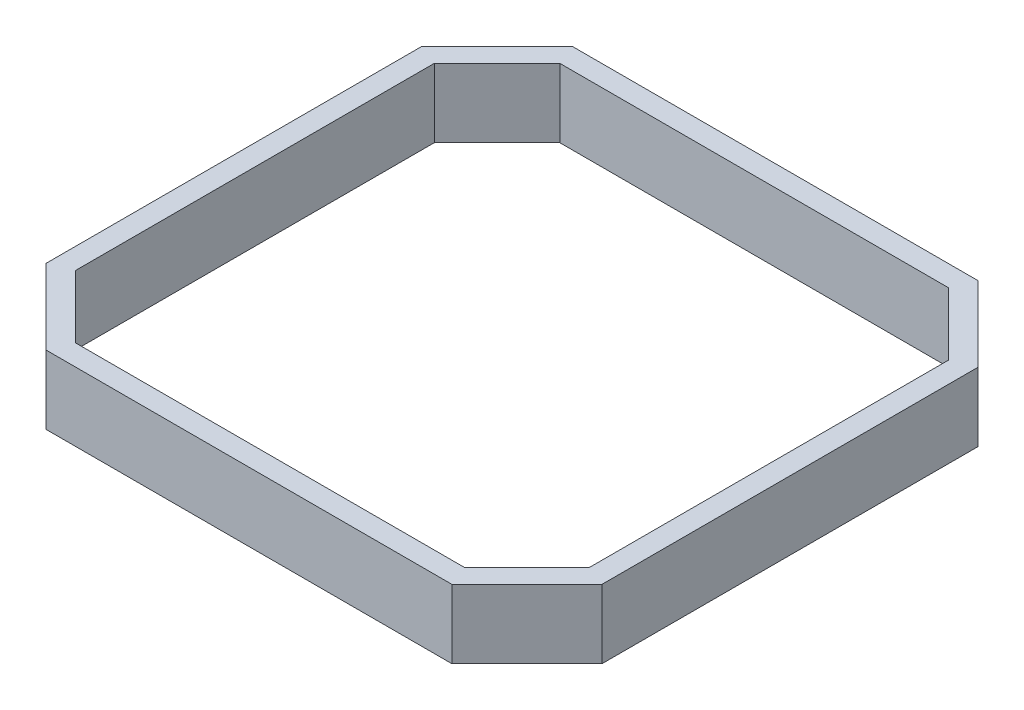
ISO-10303-21;
HEADER;
FILE_DESCRIPTION(('STEP AP214'),'2;1');
FILE_NAME('part.step','',(''),(''),'','','');
FILE_SCHEMA(('AUTOMOTIVE_DESIGN { 1 0 10303 214 1 1 1 1 }'));
ENDSEC;
DATA;
#1=APPLICATION_CONTEXT('core data for automotive mechanical design processes');
#2=APPLICATION_PROTOCOL_DEFINITION('international standard','automotive_design',2000,#1);
#3=PRODUCT_CONTEXT('',#1,'mechanical');
#4=PRODUCT('Part','Part','',(#3));
#5=PRODUCT_RELATED_PRODUCT_CATEGORY('part','',(#4));
#6=PRODUCT_DEFINITION_FORMATION('','',#4);
#7=PRODUCT_DEFINITION_CONTEXT('part definition',#1,'design');
#8=PRODUCT_DEFINITION('design','',#6,#7);
#9=PRODUCT_DEFINITION_SHAPE('','',#8);
#10=(LENGTH_UNIT() NAMED_UNIT(*) SI_UNIT(.MILLI.,.METRE.));
#11=(NAMED_UNIT(*) PLANE_ANGLE_UNIT() SI_UNIT($,.RADIAN.));
#12=(NAMED_UNIT(*) SI_UNIT($,.STERADIAN.) SOLID_ANGLE_UNIT());
#13=UNCERTAINTY_MEASURE_WITH_UNIT(LENGTH_MEASURE(1.E-05),#10,'distance_accuracy_value','');
#14=(GEOMETRIC_REPRESENTATION_CONTEXT(3) GLOBAL_UNCERTAINTY_ASSIGNED_CONTEXT((#13)) GLOBAL_UNIT_ASSIGNED_CONTEXT((#10,
#11,#12)) REPRESENTATION_CONTEXT('',''));
#15=CARTESIAN_POINT('',(0.,0.,0.));
#16=DIRECTION('',(0.,0.,1.));
#17=DIRECTION('',(1.,0.,0.));
#18=AXIS2_PLACEMENT_3D('',#15,#16,#17);
#19=CARTESIAN_POINT('',(0.,11.5,0.));
#20=DIRECTION('',(0.,-1.,0.));
#21=DIRECTION('',(0.,0.,-1.));
#22=AXIS2_PLACEMENT_3D('',#19,#20,#21);
#23=PLANE('',#22);
#24=DIRECTION('',(0.,0.,1.));
#25=VECTOR('',#24,1.);
#26=CARTESIAN_POINT('',(-46.5,11.5,31.4497474683058));
#27=LINE('',#26,#25);
#28=CARTESIAN_POINT('',(-46.5,11.5,-31.4497474683058));
#29=VERTEX_POINT('',#28);
#30=CARTESIAN_POINT('',(-46.5,11.5,31.4497474683058));
#31=VERTEX_POINT('',#30);
#32=EDGE_CURVE('E210',#29,#31,#27,.T.);
#33=ORIENTED_EDGE('',*,*,#32,.T.);
#34=DIRECTION('',(0.707106781186547,0.,0.707106781186548));
#35=VECTOR('',#34,1.);
#36=CARTESIAN_POINT('',(-46.5,11.5,31.4497474683058));
#37=LINE('',#36,#35);
#38=CARTESIAN_POINT('',(-33.9497474683058,11.5,44.));
#39=VERTEX_POINT('',#38);
#40=EDGE_CURVE('E213',#31,#39,#37,.T.);
#41=ORIENTED_EDGE('',*,*,#40,.T.);
#42=DIRECTION('',(1.,0.,0.));
#43=VECTOR('',#42,1.);
#44=CARTESIAN_POINT('',(-33.9497474683058,11.5,44.));
#45=LINE('',#44,#43);
#46=CARTESIAN_POINT('',(33.9497474683058,11.5,44.));
#47=VERTEX_POINT('',#46);
#48=EDGE_CURVE('E216',#39,#47,#45,.T.);
#49=ORIENTED_EDGE('',*,*,#48,.T.);
#50=DIRECTION('',(0.707106781186547,0.,-0.707106781186547));
#51=VECTOR('',#50,1.);
#52=CARTESIAN_POINT('',(33.9497474683058,11.5,44.));
#53=LINE('',#52,#51);
#54=CARTESIAN_POINT('',(46.5,11.5,31.4497474683058));
#55=VERTEX_POINT('',#54);
#56=EDGE_CURVE('E218',#47,#55,#53,.T.);
#57=ORIENTED_EDGE('',*,*,#56,.T.);
#58=DIRECTION('',(0.,0.,-1.));
#59=VECTOR('',#58,1.);
#60=CARTESIAN_POINT('',(46.5,11.5,31.4497474683058));
#61=LINE('',#60,#59);
#62=CARTESIAN_POINT('',(46.5,11.5,-31.4497474683058));
#63=VERTEX_POINT('',#62);
#64=EDGE_CURVE('E220',#55,#63,#61,.T.);
#65=ORIENTED_EDGE('',*,*,#64,.T.);
#66=DIRECTION('',(-0.707106781186547,0.,-0.707106781186548));
#67=VECTOR('',#66,1.);
#68=CARTESIAN_POINT('',(33.9497474683058,11.5,-44.));
#69=LINE('',#68,#67);
#70=CARTESIAN_POINT('',(33.9497474683058,11.5,-44.));
#71=VERTEX_POINT('',#70);
#72=EDGE_CURVE('E222',#63,#71,#69,.T.);
#73=ORIENTED_EDGE('',*,*,#72,.T.);
#74=DIRECTION('',(-1.,0.,0.));
#75=VECTOR('',#74,1.);
#76=CARTESIAN_POINT('',(-33.9497474683058,11.5,-44.));
#77=LINE('',#76,#75);
#78=CARTESIAN_POINT('',(-33.9497474683058,11.5,-44.));
#79=VERTEX_POINT('',#78);
#80=EDGE_CURVE('E224',#71,#79,#77,.T.);
#81=ORIENTED_EDGE('',*,*,#80,.T.);
#82=DIRECTION('',(-0.707106781186547,0.,0.707106781186548));
#83=VECTOR('',#82,1.);
#84=CARTESIAN_POINT('',(-46.5,11.5,-31.4497474683058));
#85=LINE('',#84,#83);
#86=EDGE_CURVE('E226',#79,#29,#85,.T.);
#87=ORIENTED_EDGE('',*,*,#86,.T.);
#88=EDGE_LOOP('',(#33,#41,#49,#57,#65,#73,#81,#87));
#89=FACE_BOUND('',#88,.T.);
#90=DIRECTION('',(0.,0.,1.));
#91=VECTOR('',#90,1.);
#92=CARTESIAN_POINT('',(-43.,11.5,30.));
#93=LINE('',#92,#91);
#94=CARTESIAN_POINT('',(-43.,11.5,-30.));
#95=VERTEX_POINT('',#94);
#96=CARTESIAN_POINT('',(-43.,11.5,30.));
#97=VERTEX_POINT('',#96);
#98=EDGE_CURVE('E145',#95,#97,#93,.T.);
#99=ORIENTED_EDGE('',*,*,#98,.F.);
#100=DIRECTION('',(-0.707106781186547,0.,0.707106781186548));
#101=VECTOR('',#100,1.);
#102=CARTESIAN_POINT('',(-43.,11.5,-30.));
#103=LINE('',#102,#101);
#104=CARTESIAN_POINT('',(-32.5,11.5,-40.5));
#105=VERTEX_POINT('',#104);
#106=EDGE_CURVE('E178',#105,#95,#103,.T.);
#107=ORIENTED_EDGE('',*,*,#106,.F.);
#108=DIRECTION('',(-1.,0.,0.));
#109=VECTOR('',#108,1.);
#110=CARTESIAN_POINT('',(-32.5,11.5,-40.5));
#111=LINE('',#110,#109);
#112=CARTESIAN_POINT('',(32.5,11.5,-40.5));
#113=VERTEX_POINT('',#112);
#114=EDGE_CURVE('E176',#113,#105,#111,.T.);
#115=ORIENTED_EDGE('',*,*,#114,.F.);
#116=DIRECTION('',(-0.707106781186547,0.,-0.707106781186548));
#117=VECTOR('',#116,1.);
#118=CARTESIAN_POINT('',(32.5,11.5,-40.5));
#119=LINE('',#118,#117);
#120=CARTESIAN_POINT('',(43.,11.5,-30.));
#121=VERTEX_POINT('',#120);
#122=EDGE_CURVE('E174',#121,#113,#119,.T.);
#123=ORIENTED_EDGE('',*,*,#122,.F.);
#124=DIRECTION('',(0.,0.,-1.));
#125=VECTOR('',#124,1.);
#126=CARTESIAN_POINT('',(43.,11.5,30.));
#127=LINE('',#126,#125);
#128=CARTESIAN_POINT('',(43.,11.5,30.));
#129=VERTEX_POINT('',#128);
#130=EDGE_CURVE('E172',#129,#121,#127,.T.);
#131=ORIENTED_EDGE('',*,*,#130,.F.);
#132=DIRECTION('',(0.707106781186547,0.,-0.707106781186548));
#133=VECTOR('',#132,1.);
#134=CARTESIAN_POINT('',(32.5,11.5,40.5));
#135=LINE('',#134,#133);
#136=CARTESIAN_POINT('',(32.5,11.5,40.5));
#137=VERTEX_POINT('',#136);
#138=EDGE_CURVE('E168',#137,#129,#135,.T.);
#139=ORIENTED_EDGE('',*,*,#138,.F.);
#140=DIRECTION('',(1.,0.,0.));
#141=VECTOR('',#140,1.);
#142=CARTESIAN_POINT('',(-32.5,11.5,40.5));
#143=LINE('',#142,#141);
#144=CARTESIAN_POINT('',(-32.5,11.5,40.5));
#145=VERTEX_POINT('',#144);
#146=EDGE_CURVE('E166',#145,#137,#143,.T.);
#147=ORIENTED_EDGE('',*,*,#146,.F.);
#148=DIRECTION('',(0.707106781186547,0.,0.707106781186548));
#149=VECTOR('',#148,1.);
#150=CARTESIAN_POINT('',(-43.,11.5,30.));
#151=LINE('',#150,#149);
#152=EDGE_CURVE('E153',#97,#145,#151,.T.);
#153=ORIENTED_EDGE('',*,*,#152,.F.);
#154=EDGE_LOOP('',(#99,#107,#115,#123,#131,#139,#147,#153));
#155=FACE_BOUND('',#154,.T.);
#156=ADVANCED_FACE('F32',(#89,#155),#23,.F.);
#157=CARTESIAN_POINT('',(0.,0.,0.));
#158=DIRECTION('',(0.,-1.,0.));
#159=DIRECTION('',(0.,0.,-1.));
#160=AXIS2_PLACEMENT_3D('',#157,#158,#159);
#161=PLANE('',#160);
#162=DIRECTION('',(0.,0.,1.));
#163=VECTOR('',#162,1.);
#164=CARTESIAN_POINT('',(-46.5,0.,31.4497474683058));
#165=LINE('',#164,#163);
#166=CARTESIAN_POINT('',(-46.5,0.,-31.4497474683058));
#167=VERTEX_POINT('',#166);
#168=CARTESIAN_POINT('',(-46.5,0.,31.4497474683058));
#169=VERTEX_POINT('',#168);
#170=EDGE_CURVE('E161',#167,#169,#165,.T.);
#171=ORIENTED_EDGE('',*,*,#170,.F.);
#172=DIRECTION('',(-0.707106781186547,0.,0.707106781186548));
#173=VECTOR('',#172,1.);
#174=CARTESIAN_POINT('',(-46.5,0.,-31.4497474683058));
#175=LINE('',#174,#173);
#176=CARTESIAN_POINT('',(-33.9497474683058,0.,-44.));
#177=VERTEX_POINT('',#176);
#178=EDGE_CURVE('E214',#177,#167,#175,.T.);
#179=ORIENTED_EDGE('',*,*,#178,.F.);
#180=DIRECTION('',(-1.,0.,0.));
#181=VECTOR('',#180,1.);
#182=CARTESIAN_POINT('',(-33.9497474683058,0.,-44.));
#183=LINE('',#182,#181);
#184=CARTESIAN_POINT('',(33.9497474683058,0.,-44.));
#185=VERTEX_POINT('',#184);
#186=EDGE_CURVE('E241',#185,#177,#183,.T.);
#187=ORIENTED_EDGE('',*,*,#186,.F.);
#188=DIRECTION('',(-0.707106781186547,0.,-0.707106781186548));
#189=VECTOR('',#188,1.);
#190=CARTESIAN_POINT('',(33.9497474683058,0.,-44.));
#191=LINE('',#190,#189);
#192=CARTESIAN_POINT('',(46.5,0.,-31.4497474683058));
#193=VERTEX_POINT('',#192);
#194=EDGE_CURVE('E239',#193,#185,#191,.T.);
#195=ORIENTED_EDGE('',*,*,#194,.F.);
#196=DIRECTION('',(0.,0.,-1.));
#197=VECTOR('',#196,1.);
#198=CARTESIAN_POINT('',(46.5,0.,31.4497474683058));
#199=LINE('',#198,#197);
#200=CARTESIAN_POINT('',(46.5,0.,31.4497474683058));
#201=VERTEX_POINT('',#200);
#202=EDGE_CURVE('E237',#201,#193,#199,.T.);
#203=ORIENTED_EDGE('',*,*,#202,.F.);
#204=DIRECTION('',(0.707106781186547,0.,-0.707106781186547));
#205=VECTOR('',#204,1.);
#206=CARTESIAN_POINT('',(33.9497474683058,0.,44.));
#207=LINE('',#206,#205);
#208=CARTESIAN_POINT('',(33.9497474683058,0.,44.));
#209=VERTEX_POINT('',#208);
#210=EDGE_CURVE('E235',#209,#201,#207,.T.);
#211=ORIENTED_EDGE('',*,*,#210,.F.);
#212=DIRECTION('',(1.,0.,0.));
#213=VECTOR('',#212,1.);
#214=CARTESIAN_POINT('',(-33.9497474683058,0.,44.));
#215=LINE('',#214,#213);
#216=CARTESIAN_POINT('',(-33.9497474683058,0.,44.));
#217=VERTEX_POINT('',#216);
#218=EDGE_CURVE('E233',#217,#209,#215,.T.);
#219=ORIENTED_EDGE('',*,*,#218,.F.);
#220=DIRECTION('',(0.707106781186547,0.,0.707106781186548));
#221=VECTOR('',#220,1.);
#222=CARTESIAN_POINT('',(-46.5,0.,31.4497474683058));
#223=LINE('',#222,#221);
#224=EDGE_CURVE('E231',#169,#217,#223,.T.);
#225=ORIENTED_EDGE('',*,*,#224,.F.);
#226=EDGE_LOOP('',(#171,#179,#187,#195,#203,#211,#219,#225));
#227=FACE_BOUND('',#226,.T.);
#228=DIRECTION('',(-0.707106781186547,0.,0.707106781186548));
#229=VECTOR('',#228,1.);
#230=CARTESIAN_POINT('',(-43.,0.,-30.));
#231=LINE('',#230,#229);
#232=CARTESIAN_POINT('',(-32.5,0.,-40.5));
#233=VERTEX_POINT('',#232);
#234=CARTESIAN_POINT('',(-43.,0.,-30.));
#235=VERTEX_POINT('',#234);
#236=EDGE_CURVE('E154',#233,#235,#231,.T.);
#237=ORIENTED_EDGE('',*,*,#236,.T.);
#238=DIRECTION('',(0.,0.,1.));
#239=VECTOR('',#238,1.);
#240=CARTESIAN_POINT('',(-43.,0.,30.));
#241=LINE('',#240,#239);
#242=CARTESIAN_POINT('',(-43.,0.,30.));
#243=VERTEX_POINT('',#242);
#244=EDGE_CURVE('E55',#235,#243,#241,.T.);
#245=ORIENTED_EDGE('',*,*,#244,.T.);
#246=DIRECTION('',(0.707106781186547,0.,0.707106781186548));
#247=VECTOR('',#246,1.);
#248=CARTESIAN_POINT('',(-43.,0.,30.));
#249=LINE('',#248,#247);
#250=CARTESIAN_POINT('',(-32.5,0.,40.5));
#251=VERTEX_POINT('',#250);
#252=EDGE_CURVE('E160',#243,#251,#249,.T.);
#253=ORIENTED_EDGE('',*,*,#252,.T.);
#254=DIRECTION('',(1.,0.,0.));
#255=VECTOR('',#254,1.);
#256=CARTESIAN_POINT('',(-32.5,0.,40.5));
#257=LINE('',#256,#255);
#258=CARTESIAN_POINT('',(32.5,0.,40.5));
#259=VERTEX_POINT('',#258);
#260=EDGE_CURVE('E182',#251,#259,#257,.T.);
#261=ORIENTED_EDGE('',*,*,#260,.T.);
#262=DIRECTION('',(0.707106781186547,0.,-0.707106781186548));
#263=VECTOR('',#262,1.);
#264=CARTESIAN_POINT('',(32.5,0.,40.5));
#265=LINE('',#264,#263);
#266=CARTESIAN_POINT('',(43.,0.,30.));
#267=VERTEX_POINT('',#266);
#268=EDGE_CURVE('E185',#259,#267,#265,.T.);
#269=ORIENTED_EDGE('',*,*,#268,.T.);
#270=DIRECTION('',(0.,0.,-1.));
#271=VECTOR('',#270,1.);
#272=CARTESIAN_POINT('',(43.,0.,30.));
#273=LINE('',#272,#271);
#274=CARTESIAN_POINT('',(43.,0.,-30.));
#275=VERTEX_POINT('',#274);
#276=EDGE_CURVE('E188',#267,#275,#273,.T.);
#277=ORIENTED_EDGE('',*,*,#276,.T.);
#278=DIRECTION('',(-0.707106781186547,0.,-0.707106781186548));
#279=VECTOR('',#278,1.);
#280=CARTESIAN_POINT('',(32.5,0.,-40.5));
#281=LINE('',#280,#279);
#282=CARTESIAN_POINT('',(32.5,0.,-40.5));
#283=VERTEX_POINT('',#282);
#284=EDGE_CURVE('E191',#275,#283,#281,.T.);
#285=ORIENTED_EDGE('',*,*,#284,.T.);
#286=DIRECTION('',(-1.,0.,0.));
#287=VECTOR('',#286,1.);
#288=CARTESIAN_POINT('',(-32.5,0.,-40.5));
#289=LINE('',#288,#287);
#290=EDGE_CURVE('E194',#283,#233,#289,.T.);
#291=ORIENTED_EDGE('',*,*,#290,.T.);
#292=EDGE_LOOP('',(#237,#245,#253,#261,#269,#277,#285,#291));
#293=FACE_BOUND('',#292,.T.);
#294=ADVANCED_FACE('F271',(#227,#293),#161,.T.);
#295=CARTESIAN_POINT('',(-46.5,11.5,31.4497474683058));
#296=DIRECTION('',(1.,0.,0.));
#297=DIRECTION('',(0.,0.,-1.));
#298=AXIS2_PLACEMENT_3D('',#295,#296,#297);
#299=PLANE('',#298);
#300=ORIENTED_EDGE('',*,*,#170,.T.);
#301=DIRECTION('',(0.,-1.,0.));
#302=VECTOR('',#301,1.);
#303=CARTESIAN_POINT('',(-46.5,11.5,31.4497474683058));
#304=LINE('',#303,#302);
#305=EDGE_CURVE('E11',#31,#169,#304,.T.);
#306=ORIENTED_EDGE('',*,*,#305,.F.);
#307=ORIENTED_EDGE('',*,*,#32,.F.);
#308=DIRECTION('',(0.,-1.,0.));
#309=VECTOR('',#308,1.);
#310=CARTESIAN_POINT('',(-46.5,11.5,-31.4497474683058));
#311=LINE('',#310,#309);
#312=EDGE_CURVE('E228',#29,#167,#311,.T.);
#313=ORIENTED_EDGE('',*,*,#312,.T.);
#314=EDGE_LOOP('',(#300,#306,#307,#313));
#315=FACE_BOUND('',#314,.T.);
#316=ADVANCED_FACE('F34',(#315),#299,.F.);
#317=CARTESIAN_POINT('',(-46.5,11.5,31.4497474683058));
#318=DIRECTION('',(0.707106781186548,0.,-0.707106781186547));
#319=DIRECTION('',(-0.707106781186547,0.,-0.707106781186548));
#320=AXIS2_PLACEMENT_3D('',#317,#318,#319);
#321=PLANE('',#320);
#322=ORIENTED_EDGE('',*,*,#224,.T.);
#323=DIRECTION('',(0.,-1.,0.));
#324=VECTOR('',#323,1.);
#325=CARTESIAN_POINT('',(-33.9497474683058,11.5,44.));
#326=LINE('',#325,#324);
#327=EDGE_CURVE('E40',#39,#217,#326,.T.);
#328=ORIENTED_EDGE('',*,*,#327,.F.);
#329=ORIENTED_EDGE('',*,*,#40,.F.);
#330=ORIENTED_EDGE('',*,*,#305,.T.);
#331=EDGE_LOOP('',(#322,#328,#329,#330));
#332=FACE_BOUND('',#331,.T.);
#333=ADVANCED_FACE('F288',(#332),#321,.F.);
#334=CARTESIAN_POINT('',(-33.9497474683058,11.5,44.));
#335=DIRECTION('',(0.,0.,-1.));
#336=DIRECTION('',(-1.,0.,0.));
#337=AXIS2_PLACEMENT_3D('',#334,#335,#336);
#338=PLANE('',#337);
#339=ORIENTED_EDGE('',*,*,#218,.T.);
#340=DIRECTION('',(0.,-1.,0.));
#341=VECTOR('',#340,1.);
#342=CARTESIAN_POINT('',(33.9497474683058,11.5,44.));
#343=LINE('',#342,#341);
#344=EDGE_CURVE('E258',#47,#209,#343,.T.);
#345=ORIENTED_EDGE('',*,*,#344,.F.);
#346=ORIENTED_EDGE('',*,*,#48,.F.);
#347=ORIENTED_EDGE('',*,*,#327,.T.);
#348=EDGE_LOOP('',(#339,#345,#346,#347));
#349=FACE_BOUND('',#348,.T.);
#350=ADVANCED_FACE('F265',(#349),#338,.F.);
#351=CARTESIAN_POINT('',(33.9497474683058,11.5,44.));
#352=DIRECTION('',(-0.707106781186548,0.,-0.707106781186548));
#353=DIRECTION('',(-0.707106781186548,0.,0.707106781186548));
#354=AXIS2_PLACEMENT_3D('',#351,#352,#353);
#355=PLANE('',#354);
#356=ORIENTED_EDGE('',*,*,#210,.T.);
#357=DIRECTION('',(0.,-1.,0.));
#358=VECTOR('',#357,1.);
#359=CARTESIAN_POINT('',(46.5,11.5,31.4497474683058));
#360=LINE('',#359,#358);
#361=EDGE_CURVE('E255',#55,#201,#360,.T.);
#362=ORIENTED_EDGE('',*,*,#361,.F.);
#363=ORIENTED_EDGE('',*,*,#56,.F.);
#364=ORIENTED_EDGE('',*,*,#344,.T.);
#365=EDGE_LOOP('',(#356,#362,#363,#364));
#366=FACE_BOUND('',#365,.T.);
#367=ADVANCED_FACE('F277',(#366),#355,.F.);
#368=CARTESIAN_POINT('',(46.5,11.5,31.4497474683058));
#369=DIRECTION('',(-1.,0.,0.));
#370=DIRECTION('',(0.,0.,1.));
#371=AXIS2_PLACEMENT_3D('',#368,#369,#370);
#372=PLANE('',#371);
#373=ORIENTED_EDGE('',*,*,#202,.T.);
#374=DIRECTION('',(0.,-1.,0.));
#375=VECTOR('',#374,1.);
#376=CARTESIAN_POINT('',(46.5,11.5,-31.4497474683058));
#377=LINE('',#376,#375);
#378=EDGE_CURVE('E252',#63,#193,#377,.T.);
#379=ORIENTED_EDGE('',*,*,#378,.F.);
#380=ORIENTED_EDGE('',*,*,#64,.F.);
#381=ORIENTED_EDGE('',*,*,#361,.T.);
#382=EDGE_LOOP('',(#373,#379,#380,#381));
#383=FACE_BOUND('',#382,.T.);
#384=ADVANCED_FACE('F281',(#383),#372,.F.);
#385=CARTESIAN_POINT('',(33.9497474683058,11.5,-44.));
#386=DIRECTION('',(-0.707106781186548,0.,0.707106781186547));
#387=DIRECTION('',(0.707106781186547,0.,0.707106781186548));
#388=AXIS2_PLACEMENT_3D('',#385,#386,#387);
#389=PLANE('',#388);
#390=ORIENTED_EDGE('',*,*,#194,.T.);
#391=DIRECTION('',(0.,-1.,0.));
#392=VECTOR('',#391,1.);
#393=CARTESIAN_POINT('',(33.9497474683058,11.5,-44.));
#394=LINE('',#393,#392);
#395=EDGE_CURVE('E249',#71,#185,#394,.T.);
#396=ORIENTED_EDGE('',*,*,#395,.F.);
#397=ORIENTED_EDGE('',*,*,#72,.F.);
#398=ORIENTED_EDGE('',*,*,#378,.T.);
#399=EDGE_LOOP('',(#390,#396,#397,#398));
#400=FACE_BOUND('',#399,.T.);
#401=ADVANCED_FACE('F301',(#400),#389,.F.);
#402=CARTESIAN_POINT('',(-33.9497474683058,11.5,-44.));
#403=DIRECTION('',(0.,0.,1.));
#404=DIRECTION('',(1.,0.,0.));
#405=AXIS2_PLACEMENT_3D('',#402,#403,#404);
#406=PLANE('',#405);
#407=ORIENTED_EDGE('',*,*,#186,.T.);
#408=DIRECTION('',(0.,-1.,0.));
#409=VECTOR('',#408,1.);
#410=CARTESIAN_POINT('',(-33.9497474683058,11.5,-44.));
#411=LINE('',#410,#409);
#412=EDGE_CURVE('E246',#79,#177,#411,.T.);
#413=ORIENTED_EDGE('',*,*,#412,.F.);
#414=ORIENTED_EDGE('',*,*,#80,.F.);
#415=ORIENTED_EDGE('',*,*,#395,.T.);
#416=EDGE_LOOP('',(#407,#413,#414,#415));
#417=FACE_BOUND('',#416,.T.);
#418=ADVANCED_FACE('F299',(#417),#406,.F.);
#419=CARTESIAN_POINT('',(-46.5,11.5,-31.4497474683058));
#420=DIRECTION('',(0.707106781186548,0.,0.707106781186547));
#421=DIRECTION('',(0.707106781186547,0.,-0.707106781186548));
#422=AXIS2_PLACEMENT_3D('',#419,#420,#421);
#423=PLANE('',#422);
#424=ORIENTED_EDGE('',*,*,#178,.T.);
#425=ORIENTED_EDGE('',*,*,#312,.F.);
#426=ORIENTED_EDGE('',*,*,#86,.F.);
#427=ORIENTED_EDGE('',*,*,#412,.T.);
#428=EDGE_LOOP('',(#424,#425,#426,#427));
#429=FACE_BOUND('',#428,.T.);
#430=ADVANCED_FACE('F294',(#429),#423,.F.);
#431=CARTESIAN_POINT('',(-43.,11.5,30.));
#432=DIRECTION('',(1.,0.,0.));
#433=DIRECTION('',(0.,0.,-1.));
#434=AXIS2_PLACEMENT_3D('',#431,#432,#433);
#435=PLANE('',#434);
#436=ORIENTED_EDGE('',*,*,#244,.F.);
#437=DIRECTION('',(0.,-1.,0.));
#438=VECTOR('',#437,1.);
#439=CARTESIAN_POINT('',(-43.,11.5,-30.));
#440=LINE('',#439,#438);
#441=EDGE_CURVE('E149',#95,#235,#440,.T.);
#442=ORIENTED_EDGE('',*,*,#441,.F.);
#443=ORIENTED_EDGE('',*,*,#98,.T.);
#444=DIRECTION('',(0.,-1.,0.));
#445=VECTOR('',#444,1.);
#446=CARTESIAN_POINT('',(-43.,11.5,30.));
#447=LINE('',#446,#445);
#448=EDGE_CURVE('E148',#97,#243,#447,.T.);
#449=ORIENTED_EDGE('',*,*,#448,.T.);
#450=EDGE_LOOP('',(#436,#442,#443,#449));
#451=FACE_BOUND('',#450,.T.);
#452=ADVANCED_FACE('F147',(#451),#435,.T.);
#453=CARTESIAN_POINT('',(-43.,11.5,30.));
#454=DIRECTION('',(0.707106781186548,0.,-0.707106781186547));
#455=DIRECTION('',(-0.707106781186547,0.,-0.707106781186548));
#456=AXIS2_PLACEMENT_3D('',#453,#454,#455);
#457=PLANE('',#456);
#458=ORIENTED_EDGE('',*,*,#252,.F.);
#459=ORIENTED_EDGE('',*,*,#448,.F.);
#460=ORIENTED_EDGE('',*,*,#152,.T.);
#461=DIRECTION('',(0.,-1.,0.));
#462=VECTOR('',#461,1.);
#463=CARTESIAN_POINT('',(-32.5,11.5,40.5));
#464=LINE('',#463,#462);
#465=EDGE_CURVE('E162',#145,#251,#464,.T.);
#466=ORIENTED_EDGE('',*,*,#465,.T.);
#467=EDGE_LOOP('',(#458,#459,#460,#466));
#468=FACE_BOUND('',#467,.T.);
#469=ADVANCED_FACE('F157',(#468),#457,.T.);
#470=CARTESIAN_POINT('',(-32.5,11.5,40.5));
#471=DIRECTION('',(0.,0.,-1.));
#472=DIRECTION('',(-1.,0.,0.));
#473=AXIS2_PLACEMENT_3D('',#470,#471,#472);
#474=PLANE('',#473);
#475=ORIENTED_EDGE('',*,*,#260,.F.);
#476=ORIENTED_EDGE('',*,*,#465,.F.);
#477=ORIENTED_EDGE('',*,*,#146,.T.);
#478=DIRECTION('',(0.,-1.,0.));
#479=VECTOR('',#478,1.);
#480=CARTESIAN_POINT('',(32.5,11.5,40.5));
#481=LINE('',#480,#479);
#482=EDGE_CURVE('E207',#137,#259,#481,.T.);
#483=ORIENTED_EDGE('',*,*,#482,.T.);
#484=EDGE_LOOP('',(#475,#476,#477,#483));
#485=FACE_BOUND('',#484,.T.);
#486=ADVANCED_FACE('F326',(#485),#474,.T.);
#487=CARTESIAN_POINT('',(32.5,11.5,40.5));
#488=DIRECTION('',(-0.707106781186548,0.,-0.707106781186547));
#489=DIRECTION('',(-0.707106781186547,0.,0.707106781186548));
#490=AXIS2_PLACEMENT_3D('',#487,#488,#489);
#491=PLANE('',#490);
#492=ORIENTED_EDGE('',*,*,#268,.F.);
#493=ORIENTED_EDGE('',*,*,#482,.F.);
#494=ORIENTED_EDGE('',*,*,#138,.T.);
#495=DIRECTION('',(0.,-1.,0.));
#496=VECTOR('',#495,1.);
#497=CARTESIAN_POINT('',(43.,11.5,30.));
#498=LINE('',#497,#496);
#499=EDGE_CURVE('E205',#129,#267,#498,.T.);
#500=ORIENTED_EDGE('',*,*,#499,.T.);
#501=EDGE_LOOP('',(#492,#493,#494,#500));
#502=FACE_BOUND('',#501,.T.);
#503=ADVANCED_FACE('F330',(#502),#491,.T.);
#504=CARTESIAN_POINT('',(43.,11.5,30.));
#505=DIRECTION('',(-1.,0.,0.));
#506=DIRECTION('',(0.,0.,1.));
#507=AXIS2_PLACEMENT_3D('',#504,#505,#506);
#508=PLANE('',#507);
#509=ORIENTED_EDGE('',*,*,#276,.F.);
#510=ORIENTED_EDGE('',*,*,#499,.F.);
#511=ORIENTED_EDGE('',*,*,#130,.T.);
#512=DIRECTION('',(0.,-1.,0.));
#513=VECTOR('',#512,1.);
#514=CARTESIAN_POINT('',(43.,11.5,-30.));
#515=LINE('',#514,#513);
#516=EDGE_CURVE('E203',#121,#275,#515,.T.);
#517=ORIENTED_EDGE('',*,*,#516,.T.);
#518=EDGE_LOOP('',(#509,#510,#511,#517));
#519=FACE_BOUND('',#518,.T.);
#520=ADVANCED_FACE('F336',(#519),#508,.T.);
#521=CARTESIAN_POINT('',(32.5,11.5,-40.5));
#522=DIRECTION('',(-0.707106781186548,0.,0.707106781186547));
#523=DIRECTION('',(0.707106781186547,0.,0.707106781186548));
#524=AXIS2_PLACEMENT_3D('',#521,#522,#523);
#525=PLANE('',#524);
#526=ORIENTED_EDGE('',*,*,#284,.F.);
#527=ORIENTED_EDGE('',*,*,#516,.F.);
#528=ORIENTED_EDGE('',*,*,#122,.T.);
#529=DIRECTION('',(0.,-1.,0.));
#530=VECTOR('',#529,1.);
#531=CARTESIAN_POINT('',(32.5,11.5,-40.5));
#532=LINE('',#531,#530);
#533=EDGE_CURVE('E201',#113,#283,#532,.T.);
#534=ORIENTED_EDGE('',*,*,#533,.T.);
#535=EDGE_LOOP('',(#526,#527,#528,#534));
#536=FACE_BOUND('',#535,.T.);
#537=ADVANCED_FACE('F340',(#536),#525,.T.);
#538=CARTESIAN_POINT('',(-32.5,11.5,-40.5));
#539=DIRECTION('',(0.,0.,1.));
#540=DIRECTION('',(1.,0.,0.));
#541=AXIS2_PLACEMENT_3D('',#538,#539,#540);
#542=PLANE('',#541);
#543=ORIENTED_EDGE('',*,*,#290,.F.);
#544=ORIENTED_EDGE('',*,*,#533,.F.);
#545=ORIENTED_EDGE('',*,*,#114,.T.);
#546=DIRECTION('',(0.,-1.,0.));
#547=VECTOR('',#546,1.);
#548=CARTESIAN_POINT('',(-32.5,11.5,-40.5));
#549=LINE('',#548,#547);
#550=EDGE_CURVE('E47',#105,#233,#549,.T.);
#551=ORIENTED_EDGE('',*,*,#550,.T.);
#552=EDGE_LOOP('',(#543,#544,#545,#551));
#553=FACE_BOUND('',#552,.T.);
#554=ADVANCED_FACE('F344',(#553),#542,.T.);
#555=CARTESIAN_POINT('',(-43.,11.5,-30.));
#556=DIRECTION('',(0.707106781186548,0.,0.707106781186547));
#557=DIRECTION('',(0.707106781186547,0.,-0.707106781186548));
#558=AXIS2_PLACEMENT_3D('',#555,#556,#557);
#559=PLANE('',#558);
#560=ORIENTED_EDGE('',*,*,#236,.F.);
#561=ORIENTED_EDGE('',*,*,#550,.F.);
#562=ORIENTED_EDGE('',*,*,#106,.T.);
#563=ORIENTED_EDGE('',*,*,#441,.T.);
#564=EDGE_LOOP('',(#560,#561,#562,#563));
#565=FACE_BOUND('',#564,.T.);
#566=ADVANCED_FACE('F348',(#565),#559,.T.);
#567=CLOSED_SHELL('',(#156,#294,#316,#333,#350,#367,#384,#401,#418,#430,#452,#469,#486,#503,
#520,#537,#554,#566));
#568=MANIFOLD_SOLID_BREP('B2',#567);
#569=ADVANCED_BREP_SHAPE_REPRESENTATION('',(#18,#568),#14);
#570=SHAPE_DEFINITION_REPRESENTATION(#9,#569);
ENDSEC;
END-ISO-10303-21;
